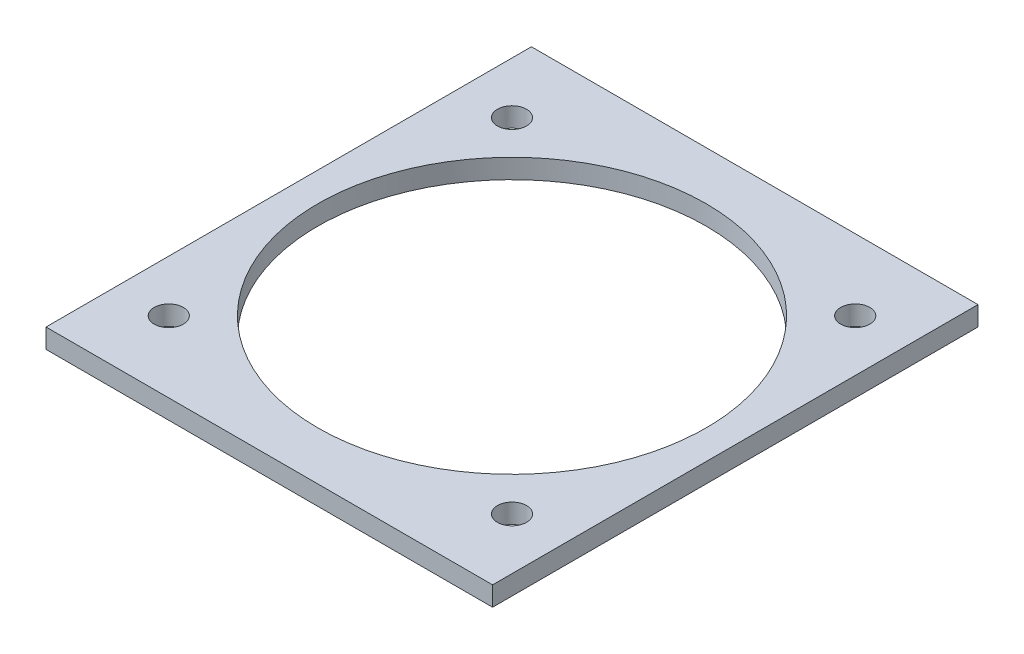
ISO-10303-21;
HEADER;
FILE_DESCRIPTION(('STEP AP214'),'2;1');
FILE_NAME('part.step','',(''),(''),'','','');
FILE_SCHEMA(('AUTOMOTIVE_DESIGN { 1 0 10303 214 1 1 1 1 }'));
ENDSEC;
DATA;
#1=APPLICATION_CONTEXT('core data for automotive mechanical design processes');
#2=APPLICATION_PROTOCOL_DEFINITION('international standard','automotive_design',2000,#1);
#3=PRODUCT_CONTEXT('',#1,'mechanical');
#4=PRODUCT('Part','Part','',(#3));
#5=PRODUCT_RELATED_PRODUCT_CATEGORY('part','',(#4));
#6=PRODUCT_DEFINITION_FORMATION('','',#4);
#7=PRODUCT_DEFINITION_CONTEXT('part definition',#1,'design');
#8=PRODUCT_DEFINITION('design','',#6,#7);
#9=PRODUCT_DEFINITION_SHAPE('','',#8);
#10=(LENGTH_UNIT() NAMED_UNIT(*) SI_UNIT(.MILLI.,.METRE.));
#11=(NAMED_UNIT(*) PLANE_ANGLE_UNIT() SI_UNIT($,.RADIAN.));
#12=(NAMED_UNIT(*) SI_UNIT($,.STERADIAN.) SOLID_ANGLE_UNIT());
#13=UNCERTAINTY_MEASURE_WITH_UNIT(LENGTH_MEASURE(1.E-05),#10,'distance_accuracy_value','');
#14=(GEOMETRIC_REPRESENTATION_CONTEXT(3) GLOBAL_UNCERTAINTY_ASSIGNED_CONTEXT((#13)) GLOBAL_UNIT_ASSIGNED_CONTEXT((#10,
#11,#12)) REPRESENTATION_CONTEXT('',''));
#15=CARTESIAN_POINT('',(0.,0.,0.));
#16=DIRECTION('',(0.,0.,1.));
#17=DIRECTION('',(1.,0.,0.));
#18=AXIS2_PLACEMENT_3D('',#15,#16,#17);
#19=CARTESIAN_POINT('',(23.,2.,25.));
#20=DIRECTION('',(-1.,0.,0.));
#21=DIRECTION('',(0.,0.,1.));
#22=AXIS2_PLACEMENT_3D('',#19,#20,#21);
#23=PLANE('',#22);
#24=DIRECTION('',(0.,0.,-1.));
#25=VECTOR('',#24,1.);
#26=CARTESIAN_POINT('',(23.,0.,25.));
#27=LINE('',#26,#25);
#28=CARTESIAN_POINT('',(23.,0.,25.));
#29=VERTEX_POINT('',#28);
#30=CARTESIAN_POINT('',(23.,0.,-25.));
#31=VERTEX_POINT('',#30);
#32=EDGE_CURVE('E107',#29,#31,#27,.T.);
#33=ORIENTED_EDGE('',*,*,#32,.T.);
#34=DIRECTION('',(0.,-1.,0.));
#35=VECTOR('',#34,1.);
#36=CARTESIAN_POINT('',(23.,2.,-25.));
#37=LINE('',#36,#35);
#38=CARTESIAN_POINT('',(23.,2.,-25.));
#39=VERTEX_POINT('',#38);
#40=EDGE_CURVE('E11',#39,#31,#37,.T.);
#41=ORIENTED_EDGE('',*,*,#40,.F.);
#42=DIRECTION('',(0.,0.,-1.));
#43=VECTOR('',#42,1.);
#44=CARTESIAN_POINT('',(23.,2.,25.));
#45=LINE('',#44,#43);
#46=CARTESIAN_POINT('',(23.,2.,25.));
#47=VERTEX_POINT('',#46);
#48=EDGE_CURVE('E91',#47,#39,#45,.T.);
#49=ORIENTED_EDGE('',*,*,#48,.F.);
#50=DIRECTION('',(0.,-1.,0.));
#51=VECTOR('',#50,1.);
#52=CARTESIAN_POINT('',(23.,2.,25.));
#53=LINE('',#52,#51);
#54=EDGE_CURVE('E103',#47,#29,#53,.T.);
#55=ORIENTED_EDGE('',*,*,#54,.T.);
#56=EDGE_LOOP('',(#33,#41,#49,#55));
#57=FACE_BOUND('',#56,.T.);
#58=ADVANCED_FACE('F39',(#57),#23,.F.);
#59=CARTESIAN_POINT('',(-23.,2.,-25.));
#60=DIRECTION('',(0.,0.,1.));
#61=DIRECTION('',(1.,0.,0.));
#62=AXIS2_PLACEMENT_3D('',#59,#60,#61);
#63=PLANE('',#62);
#64=DIRECTION('',(-1.,0.,0.));
#65=VECTOR('',#64,1.);
#66=CARTESIAN_POINT('',(-23.,0.,-25.));
#67=LINE('',#66,#65);
#68=CARTESIAN_POINT('',(-23.,0.,-25.));
#69=VERTEX_POINT('',#68);
#70=EDGE_CURVE('E96',#31,#69,#67,.T.);
#71=ORIENTED_EDGE('',*,*,#70,.T.);
#72=DIRECTION('',(0.,-1.,0.));
#73=VECTOR('',#72,1.);
#74=CARTESIAN_POINT('',(-23.,2.,-25.));
#75=LINE('',#74,#73);
#76=CARTESIAN_POINT('',(-23.,2.,-25.));
#77=VERTEX_POINT('',#76);
#78=EDGE_CURVE('E48',#77,#69,#75,.T.);
#79=ORIENTED_EDGE('',*,*,#78,.F.);
#80=DIRECTION('',(-1.,0.,0.));
#81=VECTOR('',#80,1.);
#82=CARTESIAN_POINT('',(-23.,2.,-25.));
#83=LINE('',#82,#81);
#84=EDGE_CURVE('E86',#39,#77,#83,.T.);
#85=ORIENTED_EDGE('',*,*,#84,.F.);
#86=ORIENTED_EDGE('',*,*,#40,.T.);
#87=EDGE_LOOP('',(#71,#79,#85,#86));
#88=FACE_BOUND('',#87,.T.);
#89=ADVANCED_FACE('F95',(#88),#63,.F.);
#90=CARTESIAN_POINT('',(-23.,2.,25.));
#91=DIRECTION('',(1.,0.,0.));
#92=DIRECTION('',(0.,0.,-1.));
#93=AXIS2_PLACEMENT_3D('',#90,#91,#92);
#94=PLANE('',#93);
#95=DIRECTION('',(0.,0.,1.));
#96=VECTOR('',#95,1.);
#97=CARTESIAN_POINT('',(-23.,0.,25.));
#98=LINE('',#97,#96);
#99=CARTESIAN_POINT('',(-23.,0.,25.));
#100=VERTEX_POINT('',#99);
#101=EDGE_CURVE('E73',#69,#100,#98,.T.);
#102=ORIENTED_EDGE('',*,*,#101,.T.);
#103=DIRECTION('',(0.,-1.,0.));
#104=VECTOR('',#103,1.);
#105=CARTESIAN_POINT('',(-23.,2.,25.));
#106=LINE('',#105,#104);
#107=CARTESIAN_POINT('',(-23.,2.,25.));
#108=VERTEX_POINT('',#107);
#109=EDGE_CURVE('E98',#108,#100,#106,.T.);
#110=ORIENTED_EDGE('',*,*,#109,.F.);
#111=DIRECTION('',(0.,0.,1.));
#112=VECTOR('',#111,1.);
#113=CARTESIAN_POINT('',(-23.,2.,25.));
#114=LINE('',#113,#112);
#115=EDGE_CURVE('E89',#77,#108,#114,.T.);
#116=ORIENTED_EDGE('',*,*,#115,.F.);
#117=ORIENTED_EDGE('',*,*,#78,.T.);
#118=EDGE_LOOP('',(#102,#110,#116,#117));
#119=FACE_BOUND('',#118,.T.);
#120=ADVANCED_FACE('F99',(#119),#94,.F.);
#121=CARTESIAN_POINT('',(-23.,2.,25.));
#122=DIRECTION('',(0.,0.,-1.));
#123=DIRECTION('',(-1.,0.,0.));
#124=AXIS2_PLACEMENT_3D('',#121,#122,#123);
#125=PLANE('',#124);
#126=DIRECTION('',(1.,0.,0.));
#127=VECTOR('',#126,1.);
#128=CARTESIAN_POINT('',(-23.,0.,25.));
#129=LINE('',#128,#127);
#130=EDGE_CURVE('E79',#100,#29,#129,.T.);
#131=ORIENTED_EDGE('',*,*,#130,.T.);
#132=ORIENTED_EDGE('',*,*,#54,.F.);
#133=DIRECTION('',(1.,0.,0.));
#134=VECTOR('',#133,1.);
#135=CARTESIAN_POINT('',(-23.,2.,25.));
#136=LINE('',#135,#134);
#137=EDGE_CURVE('E56',#108,#47,#136,.T.);
#138=ORIENTED_EDGE('',*,*,#137,.F.);
#139=ORIENTED_EDGE('',*,*,#109,.T.);
#140=EDGE_LOOP('',(#131,#132,#138,#139));
#141=FACE_BOUND('',#140,.T.);
#142=ADVANCED_FACE('F121',(#141),#125,.F.);
#143=CARTESIAN_POINT('',(0.,2.,0.));
#144=DIRECTION('',(0.,-1.,0.));
#145=DIRECTION('',(0.,0.,-1.));
#146=AXIS2_PLACEMENT_3D('',#143,#144,#145);
#147=PLANE('',#146);
#148=CARTESIAN_POINT('',(17.6776695296637,2.,-17.6776695296637));
#149=DIRECTION('',(0.,1.,0.));
#150=DIRECTION('',(0.,0.,1.));
#151=AXIS2_PLACEMENT_3D('',#148,#149,#150);
#152=CIRCLE('',#151,1.5);
#153=CARTESIAN_POINT('',(17.6776695296637,2.,-16.1776695296637));
#154=VERTEX_POINT('',#153);
#155=EDGE_CURVE('E144',#154,#154,#152,.T.);
#156=ORIENTED_EDGE('',*,*,#155,.F.);
#157=EDGE_LOOP('',(#156));
#158=FACE_BOUND('',#157,.T.);
#159=CARTESIAN_POINT('',(17.6776695296638,2.,17.6776695296636));
#160=DIRECTION('',(0.,1.,0.));
#161=DIRECTION('',(0.,0.,1.));
#162=AXIS2_PLACEMENT_3D('',#159,#160,#161);
#163=CIRCLE('',#162,1.5);
#164=CARTESIAN_POINT('',(17.6776695296638,2.,19.1776695296636));
#165=VERTEX_POINT('',#164);
#166=EDGE_CURVE('E152',#165,#165,#163,.T.);
#167=ORIENTED_EDGE('',*,*,#166,.F.);
#168=EDGE_LOOP('',(#167));
#169=FACE_BOUND('',#168,.T.);
#170=CARTESIAN_POINT('',(-17.6776695296637,2.,17.6776695296637));
#171=DIRECTION('',(0.,1.,0.));
#172=DIRECTION('',(0.,0.,1.));
#173=AXIS2_PLACEMENT_3D('',#170,#171,#172);
#174=CIRCLE('',#173,1.5);
#175=CARTESIAN_POINT('',(-17.6776695296637,2.,19.1776695296637));
#176=VERTEX_POINT('',#175);
#177=EDGE_CURVE('E160',#176,#176,#174,.T.);
#178=ORIENTED_EDGE('',*,*,#177,.F.);
#179=EDGE_LOOP('',(#178));
#180=FACE_BOUND('',#179,.T.);
#181=CARTESIAN_POINT('',(-17.6776695296638,2.,-17.6776695296636));
#182=DIRECTION('',(0.,1.,0.));
#183=DIRECTION('',(0.,0.,1.));
#184=AXIS2_PLACEMENT_3D('',#181,#182,#183);
#185=CIRCLE('',#184,1.5);
#186=CARTESIAN_POINT('',(-17.6776695296638,2.,-16.1776695296636));
#187=VERTEX_POINT('',#186);
#188=EDGE_CURVE('E136',#187,#187,#185,.T.);
#189=ORIENTED_EDGE('',*,*,#188,.F.);
#190=EDGE_LOOP('',(#189));
#191=FACE_BOUND('',#190,.T.);
#192=CARTESIAN_POINT('',(0.,2.,0.));
#193=DIRECTION('',(0.,1.,0.));
#194=DIRECTION('',(0.,0.,1.));
#195=AXIS2_PLACEMENT_3D('',#192,#193,#194);
#196=CIRCLE('',#195,20.);
#197=CARTESIAN_POINT('',(0.,2.,20.));
#198=VERTEX_POINT('',#197);
#199=EDGE_CURVE('E128',#198,#198,#196,.T.);
#200=ORIENTED_EDGE('',*,*,#199,.F.);
#201=EDGE_LOOP('',(#200));
#202=FACE_BOUND('',#201,.T.);
#203=ORIENTED_EDGE('',*,*,#48,.T.);
#204=ORIENTED_EDGE('',*,*,#84,.T.);
#205=ORIENTED_EDGE('',*,*,#115,.T.);
#206=ORIENTED_EDGE('',*,*,#137,.T.);
#207=EDGE_LOOP('',(#203,#204,#205,#206));
#208=FACE_BOUND('',#207,.T.);
#209=ADVANCED_FACE('F87',(#158,#169,#180,#191,#202,#208),#147,.F.);
#210=CARTESIAN_POINT('',(0.,0.,0.));
#211=DIRECTION('',(0.,-1.,0.));
#212=DIRECTION('',(0.,0.,-1.));
#213=AXIS2_PLACEMENT_3D('',#210,#211,#212);
#214=PLANE('',#213);
#215=CARTESIAN_POINT('',(17.6776695296637,0.,-17.6776695296637));
#216=DIRECTION('',(0.,1.,0.));
#217=DIRECTION('',(0.,0.,1.));
#218=AXIS2_PLACEMENT_3D('',#215,#216,#217);
#219=CIRCLE('',#218,1.5);
#220=CARTESIAN_POINT('',(17.6776695296637,0.,-16.1776695296637));
#221=VERTEX_POINT('',#220);
#222=EDGE_CURVE('E148',#221,#221,#219,.T.);
#223=ORIENTED_EDGE('',*,*,#222,.T.);
#224=EDGE_LOOP('',(#223));
#225=FACE_BOUND('',#224,.T.);
#226=CARTESIAN_POINT('',(17.6776695296638,0.,17.6776695296636));
#227=DIRECTION('',(0.,1.,0.));
#228=DIRECTION('',(0.,0.,1.));
#229=AXIS2_PLACEMENT_3D('',#226,#227,#228);
#230=CIRCLE('',#229,1.5);
#231=CARTESIAN_POINT('',(17.6776695296638,0.,19.1776695296636));
#232=VERTEX_POINT('',#231);
#233=EDGE_CURVE('E156',#232,#232,#230,.T.);
#234=ORIENTED_EDGE('',*,*,#233,.T.);
#235=EDGE_LOOP('',(#234));
#236=FACE_BOUND('',#235,.T.);
#237=CARTESIAN_POINT('',(-17.6776695296637,0.,17.6776695296637));
#238=DIRECTION('',(0.,1.,0.));
#239=DIRECTION('',(0.,0.,1.));
#240=AXIS2_PLACEMENT_3D('',#237,#238,#239);
#241=CIRCLE('',#240,1.5);
#242=CARTESIAN_POINT('',(-17.6776695296637,0.,19.1776695296637));
#243=VERTEX_POINT('',#242);
#244=EDGE_CURVE('E140',#243,#243,#241,.T.);
#245=ORIENTED_EDGE('',*,*,#244,.T.);
#246=EDGE_LOOP('',(#245));
#247=FACE_BOUND('',#246,.T.);
#248=CARTESIAN_POINT('',(-17.6776695296638,0.,-17.6776695296636));
#249=DIRECTION('',(0.,1.,0.));
#250=DIRECTION('',(0.,0.,1.));
#251=AXIS2_PLACEMENT_3D('',#248,#249,#250);
#252=CIRCLE('',#251,1.5);
#253=CARTESIAN_POINT('',(-17.6776695296638,0.,-16.1776695296636));
#254=VERTEX_POINT('',#253);
#255=EDGE_CURVE('E132',#254,#254,#252,.T.);
#256=ORIENTED_EDGE('',*,*,#255,.T.);
#257=EDGE_LOOP('',(#256));
#258=FACE_BOUND('',#257,.T.);
#259=CARTESIAN_POINT('',(0.,0.,0.));
#260=DIRECTION('',(0.,1.,0.));
#261=DIRECTION('',(0.,0.,1.));
#262=AXIS2_PLACEMENT_3D('',#259,#260,#261);
#263=CIRCLE('',#262,20.);
#264=CARTESIAN_POINT('',(0.,0.,20.));
#265=VERTEX_POINT('',#264);
#266=EDGE_CURVE('E111',#265,#265,#263,.T.);
#267=ORIENTED_EDGE('',*,*,#266,.T.);
#268=EDGE_LOOP('',(#267));
#269=FACE_BOUND('',#268,.T.);
#270=ORIENTED_EDGE('',*,*,#32,.F.);
#271=ORIENTED_EDGE('',*,*,#130,.F.);
#272=ORIENTED_EDGE('',*,*,#101,.F.);
#273=ORIENTED_EDGE('',*,*,#70,.F.);
#274=EDGE_LOOP('',(#270,#271,#272,#273));
#275=FACE_BOUND('',#274,.T.);
#276=ADVANCED_FACE('F124',(#225,#236,#247,#258,#269,#275),#214,.T.);
#277=CARTESIAN_POINT('',(0.,0.,0.));
#278=DIRECTION('',(0.,1.,0.));
#279=DIRECTION('',(0.,0.,1.));
#280=AXIS2_PLACEMENT_3D('',#277,#278,#279);
#281=CYLINDRICAL_SURFACE('',#280,20.);
#282=ORIENTED_EDGE('',*,*,#266,.F.);
#283=EDGE_LOOP('',(#282));
#284=FACE_BOUND('',#283,.T.);
#285=ORIENTED_EDGE('',*,*,#199,.T.);
#286=EDGE_LOOP('',(#285));
#287=FACE_BOUND('',#286,.T.);
#288=ADVANCED_FACE('F186',(#284,#287),#281,.F.);
#289=CARTESIAN_POINT('',(-17.6776695296638,0.,-17.6776695296636));
#290=DIRECTION('',(0.,1.,0.));
#291=DIRECTION('',(0.,0.,1.));
#292=AXIS2_PLACEMENT_3D('',#289,#290,#291);
#293=CYLINDRICAL_SURFACE('',#292,1.5);
#294=ORIENTED_EDGE('',*,*,#255,.F.);
#295=EDGE_LOOP('',(#294));
#296=FACE_BOUND('',#295,.T.);
#297=ORIENTED_EDGE('',*,*,#188,.T.);
#298=EDGE_LOOP('',(#297));
#299=FACE_BOUND('',#298,.T.);
#300=ADVANCED_FACE('F174',(#296,#299),#293,.F.);
#301=CARTESIAN_POINT('',(-17.6776695296637,0.,17.6776695296637));
#302=DIRECTION('',(0.,1.,0.));
#303=DIRECTION('',(0.,0.,1.));
#304=AXIS2_PLACEMENT_3D('',#301,#302,#303);
#305=CYLINDRICAL_SURFACE('',#304,1.5);
#306=ORIENTED_EDGE('',*,*,#244,.F.);
#307=EDGE_LOOP('',(#306));
#308=FACE_BOUND('',#307,.T.);
#309=ORIENTED_EDGE('',*,*,#177,.T.);
#310=EDGE_LOOP('',(#309));
#311=FACE_BOUND('',#310,.T.);
#312=ADVANCED_FACE('F170',(#308,#311),#305,.F.);
#313=CARTESIAN_POINT('',(17.6776695296638,0.,17.6776695296636));
#314=DIRECTION('',(0.,1.,0.));
#315=DIRECTION('',(0.,0.,1.));
#316=AXIS2_PLACEMENT_3D('',#313,#314,#315);
#317=CYLINDRICAL_SURFACE('',#316,1.5);
#318=ORIENTED_EDGE('',*,*,#233,.F.);
#319=EDGE_LOOP('',(#318));
#320=FACE_BOUND('',#319,.T.);
#321=ORIENTED_EDGE('',*,*,#166,.T.);
#322=EDGE_LOOP('',(#321));
#323=FACE_BOUND('',#322,.T.);
#324=ADVANCED_FACE('F173',(#320,#323),#317,.F.);
#325=CARTESIAN_POINT('',(17.6776695296637,0.,-17.6776695296637));
#326=DIRECTION('',(0.,1.,0.));
#327=DIRECTION('',(0.,0.,1.));
#328=AXIS2_PLACEMENT_3D('',#325,#326,#327);
#329=CYLINDRICAL_SURFACE('',#328,1.5);
#330=ORIENTED_EDGE('',*,*,#222,.F.);
#331=EDGE_LOOP('',(#330));
#332=FACE_BOUND('',#331,.T.);
#333=ORIENTED_EDGE('',*,*,#155,.T.);
#334=EDGE_LOOP('',(#333));
#335=FACE_BOUND('',#334,.T.);
#336=ADVANCED_FACE('F243',(#332,#335),#329,.F.);
#337=CLOSED_SHELL('',(#58,#89,#120,#142,#209,#276,#288,#300,#312,#324,#336));
#338=MANIFOLD_SOLID_BREP('B2',#337);
#339=ADVANCED_BREP_SHAPE_REPRESENTATION('',(#18,#338),#14);
#340=SHAPE_DEFINITION_REPRESENTATION(#9,#339);
ENDSEC;
END-ISO-10303-21;
